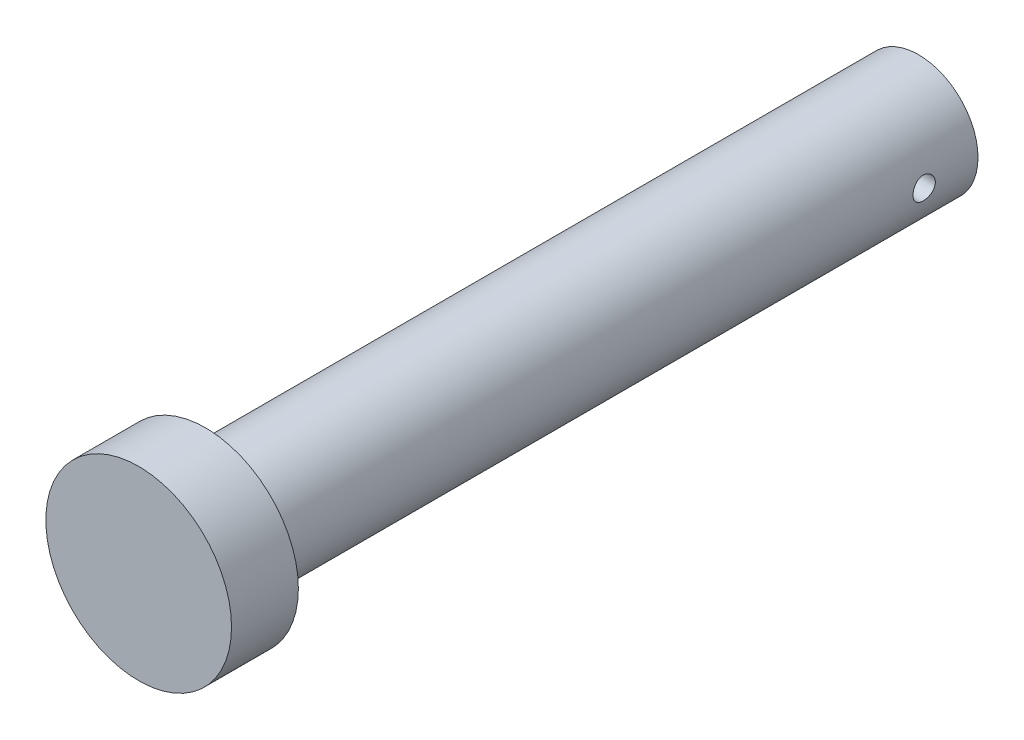
ISO-10303-21;
HEADER;
FILE_DESCRIPTION(('STEP AP214'),'2;1');
FILE_NAME('part.step','',(''),(''),'','','');
FILE_SCHEMA(('AUTOMOTIVE_DESIGN { 1 0 10303 214 1 1 1 1 }'));
ENDSEC;
DATA;
#1=APPLICATION_CONTEXT('core data for automotive mechanical design processes');
#2=APPLICATION_PROTOCOL_DEFINITION('international standard','automotive_design',2000,#1);
#3=PRODUCT_CONTEXT('',#1,'mechanical');
#4=PRODUCT('Part','Part','',(#3));
#5=PRODUCT_RELATED_PRODUCT_CATEGORY('part','',(#4));
#6=PRODUCT_DEFINITION_FORMATION('','',#4);
#7=PRODUCT_DEFINITION_CONTEXT('part definition',#1,'design');
#8=PRODUCT_DEFINITION('design','',#6,#7);
#9=PRODUCT_DEFINITION_SHAPE('','',#8);
#10=(LENGTH_UNIT() NAMED_UNIT(*) SI_UNIT(.MILLI.,.METRE.));
#11=(NAMED_UNIT(*) PLANE_ANGLE_UNIT() SI_UNIT($,.RADIAN.));
#12=(NAMED_UNIT(*) SI_UNIT($,.STERADIAN.) SOLID_ANGLE_UNIT());
#13=UNCERTAINTY_MEASURE_WITH_UNIT(LENGTH_MEASURE(1.E-05),#10,'distance_accuracy_value','');
#14=(GEOMETRIC_REPRESENTATION_CONTEXT(3) GLOBAL_UNCERTAINTY_ASSIGNED_CONTEXT((#13)) GLOBAL_UNIT_ASSIGNED_CONTEXT((#10,
#11,#12)) REPRESENTATION_CONTEXT('',''));
#15=CARTESIAN_POINT('',(0.,0.,0.));
#16=DIRECTION('',(0.,0.,1.));
#17=DIRECTION('',(1.,0.,0.));
#18=AXIS2_PLACEMENT_3D('',#15,#16,#17);
#19=CARTESIAN_POINT('',(0.,0.,9.));
#20=DIRECTION('',(0.,0.,-1.));
#21=DIRECTION('',(-1.,0.,0.));
#22=AXIS2_PLACEMENT_3D('',#19,#20,#21);
#23=CYLINDRICAL_SURFACE('',#22,12.5);
#24=CARTESIAN_POINT('',(0.,0.,9.));
#25=DIRECTION('',(0.,0.,1.));
#26=DIRECTION('',(1.,0.,0.));
#27=AXIS2_PLACEMENT_3D('',#24,#25,#26);
#28=CIRCLE('',#27,12.5);
#29=CARTESIAN_POINT('',(12.5,0.,9.));
#30=VERTEX_POINT('',#29);
#31=EDGE_CURVE('E10',#30,#30,#28,.T.);
#32=ORIENTED_EDGE('',*,*,#31,.F.);
#33=EDGE_LOOP('',(#32));
#34=FACE_BOUND('',#33,.T.);
#35=CARTESIAN_POINT('',(0.,0.,0.));
#36=DIRECTION('',(0.,0.,1.));
#37=DIRECTION('',(1.,0.,0.));
#38=AXIS2_PLACEMENT_3D('',#35,#36,#37);
#39=CIRCLE('',#38,12.5);
#40=CARTESIAN_POINT('',(12.5,0.,0.));
#41=VERTEX_POINT('',#40);
#42=EDGE_CURVE('E43',#41,#41,#39,.T.);
#43=ORIENTED_EDGE('',*,*,#42,.T.);
#44=EDGE_LOOP('',(#43));
#45=FACE_BOUND('',#44,.T.);
#46=ADVANCED_FACE('F31',(#34,#45),#23,.T.);
#47=CARTESIAN_POINT('',(0.,0.,9.));
#48=DIRECTION('',(0.,0.,1.));
#49=DIRECTION('',(1.,0.,0.));
#50=AXIS2_PLACEMENT_3D('',#47,#48,#49);
#51=PLANE('',#50);
#52=ORIENTED_EDGE('',*,*,#31,.T.);
#53=EDGE_LOOP('',(#52));
#54=FACE_BOUND('',#53,.T.);
#55=ADVANCED_FACE('F77',(#54),#51,.T.);
#56=CARTESIAN_POINT('',(0.,0.,0.));
#57=DIRECTION('',(0.,0.,1.));
#58=DIRECTION('',(1.,0.,0.));
#59=AXIS2_PLACEMENT_3D('',#56,#57,#58);
#60=PLANE('',#59);
#61=CARTESIAN_POINT('',(0.,0.,0.));
#62=DIRECTION('',(0.,0.,1.));
#63=DIRECTION('',(1.,0.,0.));
#64=AXIS2_PLACEMENT_3D('',#61,#62,#63);
#65=CIRCLE('',#64,8.);
#66=CARTESIAN_POINT('',(8.,0.,0.));
#67=VERTEX_POINT('',#66);
#68=EDGE_CURVE('E51',#67,#67,#65,.T.);
#69=ORIENTED_EDGE('',*,*,#68,.T.);
#70=EDGE_LOOP('',(#69));
#71=FACE_BOUND('',#70,.T.);
#72=ORIENTED_EDGE('',*,*,#42,.F.);
#73=EDGE_LOOP('',(#72));
#74=FACE_BOUND('',#73,.T.);
#75=ADVANCED_FACE('F73',(#71,#74),#60,.F.);
#76=CARTESIAN_POINT('',(0.,0.,-96.));
#77=DIRECTION('',(0.,0.,1.));
#78=DIRECTION('',(1.,0.,0.));
#79=AXIS2_PLACEMENT_3D('',#76,#77,#78);
#80=CYLINDRICAL_SURFACE('',#79,8.);
#81=CARTESIAN_POINT('',(8.,0.,-90.2552186975147));
#82=CARTESIAN_POINT('',(7.99999848833852,0.0834717464654709,-90.2552155079264));
#83=CARTESIAN_POINT('',(7.99868009921714,0.166984992730098,-90.2482276208953));
#84=CARTESIAN_POINT('',(7.9935478589052,0.331658129841798,-90.2204787023963));
#85=CARTESIAN_POINT('',(7.98973190166897,0.412815974152226,-90.199706046875));
#86=CARTESIAN_POINT('',(7.98003138765458,0.570372961851804,-90.1450459962554));
#87=CARTESIAN_POINT('',(7.97414869946483,0.646776330685349,-90.1111704450622));
#88=CARTESIAN_POINT('',(7.96095710599783,0.792807973094011,-90.0312998205919));
#89=CARTESIAN_POINT('',(7.9536483161829,0.862436794477325,-89.9853057283699));
#90=CARTESIAN_POINT('',(7.93831336430504,0.993783715930503,-89.881918929511));
#91=CARTESIAN_POINT('',(7.93028034856351,1.05540895503183,-89.8244092528446));
#92=CARTESIAN_POINT('',(7.9144531845865,1.16819606135369,-89.6998753884271));
#93=CARTESIAN_POINT('',(7.90665905354528,1.21935717689241,-89.6328505177454));
#94=CARTESIAN_POINT('',(7.89212551245005,1.31014998665793,-89.4905326091507));
#95=CARTESIAN_POINT('',(7.88539493886182,1.34968721969605,-89.4151783271975));
#96=CARTESIAN_POINT('',(7.87384713211987,1.41550524332283,-89.2587497823379));
#97=CARTESIAN_POINT('',(7.86902973396962,1.44178717713098,-89.1776760134035));
#98=CARTESIAN_POINT('',(7.8619226957455,1.480050535035,-89.0131034666003));
#99=CARTESIAN_POINT('',(7.85960445366405,1.49219390192039,-88.9296436003113));
#100=CARTESIAN_POINT('',(7.85767197152761,1.50233808095346,-88.7618413127065));
#101=CARTESIAN_POINT('',(7.8580574889876,1.50034016135374,-88.6774989712124));
#102=CARTESIAN_POINT('',(7.86146292701753,1.48238979602362,-88.5114991722486));
#103=CARTESIAN_POINT('',(7.86444808147334,1.46662149996045,-88.4298209832145));
#104=CARTESIAN_POINT('',(7.87266183284666,1.42186799396206,-88.2702902777321));
#105=CARTESIAN_POINT('',(7.87789052509516,1.39288222239499,-88.1924379240054));
#106=CARTESIAN_POINT('',(7.89003855292588,1.32233647179299,-88.0422300185145));
#107=CARTESIAN_POINT('',(7.89696783823366,1.28070213532456,-87.9699102269339));
#108=CARTESIAN_POINT('',(7.91172971602918,1.18609368930416,-87.8332139689745));
#109=CARTESIAN_POINT('',(7.91956240015522,1.13311842889266,-87.7688383097999));
#110=CARTESIAN_POINT('',(7.93540001272164,1.01633905685297,-87.6487937418423));
#111=CARTESIAN_POINT('',(7.94340571024031,0.952377436860676,-87.593278045063));
#112=CARTESIAN_POINT('',(7.95857386108318,0.815968037098823,-87.4937414568393));
#113=CARTESIAN_POINT('',(7.96573630595245,0.743520172255769,-87.4497206806443));
#114=CARTESIAN_POINT('',(7.97842539677509,0.59203498887467,-87.3744009436447));
#115=CARTESIAN_POINT('',(7.98394999136289,0.512989564446496,-87.3431179183968));
#116=CARTESIAN_POINT('',(7.99272505402719,0.350639115398697,-87.2943166044226));
#117=CARTESIAN_POINT('',(7.99597576367994,0.267334544277785,-87.2767968534693));
#118=CARTESIAN_POINT('',(7.99980360641981,0.10014865290338,-87.2562326664964));
#119=CARTESIAN_POINT('',(8.00041950912279,0.0162940126341308,-87.252978305985));
#120=CARTESIAN_POINT('',(7.99901543598228,-0.150761248092187,-87.2604741770623));
#121=CARTESIAN_POINT('',(7.99699558964431,-0.233961900480388,-87.27122372058));
#122=CARTESIAN_POINT('',(7.99057111500406,-0.396681573218219,-87.3062477326981));
#123=CARTESIAN_POINT('',(7.98618522374031,-0.476224261046065,-87.3304159800525));
#124=CARTESIAN_POINT('',(7.97551842212498,-0.630128631824633,-87.3914764042935));
#125=CARTESIAN_POINT('',(7.96923738311334,-0.704489962595101,-87.4283694450805));
#126=CARTESIAN_POINT('',(7.95538030357666,-0.846816671513211,-87.5142968256742));
#127=CARTESIAN_POINT('',(7.94779086174563,-0.91470327701512,-87.5634594360516));
#128=CARTESIAN_POINT('',(7.93219343489711,-1.04133832326455,-87.6723568348771));
#129=CARTESIAN_POINT('',(7.92418541084687,-1.10008590976087,-87.732092610516));
#130=CARTESIAN_POINT('',(7.9085247569745,-1.20757295872048,-87.8613910164262));
#131=CARTESIAN_POINT('',(7.90087825860257,-1.25616916218577,-87.9310736056401));
#132=CARTESIAN_POINT('',(7.88692985578532,-1.34096675057787,-88.0777363220385));
#133=CARTESIAN_POINT('',(7.8806279013735,-1.37716859613924,-88.1547161778852));
#134=CARTESIAN_POINT('',(7.87013024209574,-1.43594673512823,-88.3134245647573));
#135=CARTESIAN_POINT('',(7.86592440436878,-1.45858868794786,-88.3951280770741));
#136=CARTESIAN_POINT('',(7.86007203802415,-1.48980679326235,-88.5612659200361));
#137=CARTESIAN_POINT('',(7.8584252206579,-1.49838453270708,-88.6456999414851));
#138=CARTESIAN_POINT('',(7.85789199803857,-1.50117762148354,-88.8134670289562));
#139=CARTESIAN_POINT('',(7.85896215974293,-1.49561895003499,-88.8967962784717));
#140=CARTESIAN_POINT('',(7.86364600659998,-1.47079175378803,-89.06131011956));
#141=CARTESIAN_POINT('',(7.86725967655747,-1.45152331089332,-89.1424947239421));
#142=CARTESIAN_POINT('',(7.8766050802318,-1.39991887583263,-89.3002931823102));
#143=CARTESIAN_POINT('',(7.88233284594965,-1.36760735397252,-89.3769152888605));
#144=CARTESIAN_POINT('',(7.8952638755184,-1.29085868912205,-89.5236869517555));
#145=CARTESIAN_POINT('',(7.90246724360119,-1.24642068948186,-89.5938360503595));
#146=CARTESIAN_POINT('',(7.91767266107745,-1.14589487339536,-89.726802377557));
#147=CARTESIAN_POINT('',(7.92568505353043,-1.08964259864304,-89.7894941100818));
#148=CARTESIAN_POINT('',(7.94152833918735,-0.967427926742292,-89.9046238599792));
#149=CARTESIAN_POINT('',(7.94935919027328,-0.901463301891618,-89.9570595184948));
#150=CARTESIAN_POINT('',(7.96403975968049,-0.760984945071874,-90.0506296501418));
#151=CARTESIAN_POINT('',(7.97088000990561,-0.686399590640515,-90.0916581260053));
#152=CARTESIAN_POINT('',(7.98271619380687,-0.531290113653833,-90.1605363341198));
#153=CARTESIAN_POINT('',(7.98771385879037,-0.450771651705249,-90.1883984445616));
#154=CARTESIAN_POINT('',(7.99428290707632,-0.308347202825157,-90.2244960119334));
#155=CARTESIAN_POINT('',(7.99641470878206,-0.247273810251873,-90.2359973278275));
#156=CARTESIAN_POINT('',(7.9992737995401,-0.124141247115159,-90.2513597596312));
#157=CARTESIAN_POINT('',(8.00000112429805,-0.06208210165271,-90.2552210697706));
#158=CARTESIAN_POINT('',(8.,0.,-90.2552186975147));
#159=B_SPLINE_CURVE_WITH_KNOTS('',3,(#81,#82,#83,#84,#85,#86,#87,#88,#89,#90,#91,#92,#93,#94,
#95,#96,#97,#98,#99,#100,#101,#102,#103,#104,#105,#106,#107,#108,#109,#110,#111,#112,#113,#114,
#115,#116,#117,#118,#119,#120,#121,#122,#123,#124,#125,#126,#127,#128,#129,#130,#131,#132,#133,
#134,#135,#136,#137,#138,#139,#140,#141,#142,#143,#144,#145,#146,#147,#148,#149,#150,#151,#152,
#153,#154,#155,#156,#157,#158),.UNSPECIFIED.,.T.,.F.,(4,2,2,2,2,2,2,2,2,2,2,2,2,2,2,2,2,2,2,2,2,
2,2,2,2,2,2,2,2,2,2,2,2,2,2,2,2,2,4),(0.,0.250188200964925,0.500587642535452,0.750761271230911,
1.00091465336891,1.25375118013631,1.50660586283616,1.76146190504357,2.01629596311948,
2.26818151445336,2.52004447587256,2.76859000612766,3.01714609846786,3.2671926262953,
3.5172645404986,3.77127768464076,4.02529337544947,4.27962588321697,4.53393136673745,
4.78448174076096,5.03501980464583,5.28360233907827,5.53220175338031,5.78351778017707,
6.03485728413098,6.28953436987299,6.54420198954945,6.79762627818559,7.05102196946512,
7.30039252231746,7.54976158541505,7.7986649620769,8.0475859265542,8.30023369966378,
8.55293951262253,8.80792048916313,9.06266126931171,9.24874344524407,9.43482089039539),.UNSPECIFIED.);
#160=CARTESIAN_POINT('',(8.,0.,-90.2552186975147));
#161=VERTEX_POINT('',#160);
#162=EDGE_CURVE('E34',#161,#161,#159,.T.);
#163=ORIENTED_EDGE('',*,*,#162,.F.);
#164=EDGE_LOOP('',(#163));
#165=FACE_BOUND('',#164,.T.);
#166=CARTESIAN_POINT('',(-8.,0.,-90.2552186975147));
#167=CARTESIAN_POINT('',(-7.99999848833852,-0.0834717464654709,-90.2552155079264));
#168=CARTESIAN_POINT('',(-7.99868009921714,-0.166984992730098,-90.2482276208953));
#169=CARTESIAN_POINT('',(-7.9935478589052,-0.331658129841798,-90.2204787023963));
#170=CARTESIAN_POINT('',(-7.98973190166897,-0.412815974152226,-90.199706046875));
#171=CARTESIAN_POINT('',(-7.98003138765458,-0.570372961851804,-90.1450459962554));
#172=CARTESIAN_POINT('',(-7.97414869946483,-0.646776330685349,-90.1111704450622));
#173=CARTESIAN_POINT('',(-7.96095710599783,-0.792807973094011,-90.0312998205919));
#174=CARTESIAN_POINT('',(-7.9536483161829,-0.862436794477325,-89.9853057283699));
#175=CARTESIAN_POINT('',(-7.93831336430504,-0.993783715930503,-89.881918929511));
#176=CARTESIAN_POINT('',(-7.93028034856351,-1.05540895503183,-89.8244092528446));
#177=CARTESIAN_POINT('',(-7.9144531845865,-1.16819606135369,-89.6998753884271));
#178=CARTESIAN_POINT('',(-7.90665905354528,-1.21935717689241,-89.6328505177454));
#179=CARTESIAN_POINT('',(-7.89212551245005,-1.31014998665793,-89.4905326091507));
#180=CARTESIAN_POINT('',(-7.88539493886182,-1.34968721969605,-89.4151783271975));
#181=CARTESIAN_POINT('',(-7.87384713211987,-1.41550524332283,-89.2587497823379));
#182=CARTESIAN_POINT('',(-7.86902973396962,-1.44178717713098,-89.1776760134035));
#183=CARTESIAN_POINT('',(-7.8619226957455,-1.480050535035,-89.0131034666003));
#184=CARTESIAN_POINT('',(-7.85960445366405,-1.49219390192039,-88.9296436003113));
#185=CARTESIAN_POINT('',(-7.85767197152761,-1.50233808095346,-88.7618413127065));
#186=CARTESIAN_POINT('',(-7.8580574889876,-1.50034016135374,-88.6774989712124));
#187=CARTESIAN_POINT('',(-7.86146292701753,-1.48238979602362,-88.5114991722486));
#188=CARTESIAN_POINT('',(-7.86444808147334,-1.46662149996045,-88.4298209832145));
#189=CARTESIAN_POINT('',(-7.87266183284666,-1.42186799396206,-88.2702902777321));
#190=CARTESIAN_POINT('',(-7.87789052509516,-1.39288222239499,-88.1924379240054));
#191=CARTESIAN_POINT('',(-7.89003855292588,-1.32233647179299,-88.0422300185145));
#192=CARTESIAN_POINT('',(-7.89696783823366,-1.28070213532456,-87.9699102269339));
#193=CARTESIAN_POINT('',(-7.91172971602918,-1.18609368930416,-87.8332139689745));
#194=CARTESIAN_POINT('',(-7.91956240015522,-1.13311842889266,-87.7688383097999));
#195=CARTESIAN_POINT('',(-7.93540001272164,-1.01633905685297,-87.6487937418423));
#196=CARTESIAN_POINT('',(-7.94340571024031,-0.952377436860676,-87.593278045063));
#197=CARTESIAN_POINT('',(-7.95857386108318,-0.815968037098823,-87.4937414568393));
#198=CARTESIAN_POINT('',(-7.96573630595245,-0.743520172255769,-87.4497206806443));
#199=CARTESIAN_POINT('',(-7.97842539677509,-0.59203498887467,-87.3744009436447));
#200=CARTESIAN_POINT('',(-7.98394999136289,-0.512989564446496,-87.3431179183968));
#201=CARTESIAN_POINT('',(-7.99272505402719,-0.350639115398697,-87.2943166044226));
#202=CARTESIAN_POINT('',(-7.99597576367994,-0.267334544277785,-87.2767968534693));
#203=CARTESIAN_POINT('',(-7.99980360641981,-0.10014865290338,-87.2562326664964));
#204=CARTESIAN_POINT('',(-8.00041950912279,-0.0162940126341308,-87.252978305985));
#205=CARTESIAN_POINT('',(-7.99901543598228,0.150761248092187,-87.2604741770623));
#206=CARTESIAN_POINT('',(-7.99699558964431,0.233961900480388,-87.27122372058));
#207=CARTESIAN_POINT('',(-7.99057111500406,0.396681573218219,-87.3062477326981));
#208=CARTESIAN_POINT('',(-7.98618522374031,0.476224261046065,-87.3304159800525));
#209=CARTESIAN_POINT('',(-7.97551842212498,0.630128631824633,-87.3914764042935));
#210=CARTESIAN_POINT('',(-7.96923738311334,0.704489962595101,-87.4283694450805));
#211=CARTESIAN_POINT('',(-7.95538030357666,0.846816671513211,-87.5142968256742));
#212=CARTESIAN_POINT('',(-7.94779086174563,0.91470327701512,-87.5634594360516));
#213=CARTESIAN_POINT('',(-7.93219343489711,1.04133832326455,-87.6723568348771));
#214=CARTESIAN_POINT('',(-7.92418541084687,1.10008590976087,-87.732092610516));
#215=CARTESIAN_POINT('',(-7.9085247569745,1.20757295872048,-87.8613910164262));
#216=CARTESIAN_POINT('',(-7.90087825860257,1.25616916218577,-87.9310736056401));
#217=CARTESIAN_POINT('',(-7.88692985578532,1.34096675057787,-88.0777363220385));
#218=CARTESIAN_POINT('',(-7.8806279013735,1.37716859613924,-88.1547161778852));
#219=CARTESIAN_POINT('',(-7.87013024209574,1.43594673512823,-88.3134245647573));
#220=CARTESIAN_POINT('',(-7.86592440436878,1.45858868794786,-88.3951280770741));
#221=CARTESIAN_POINT('',(-7.86007203802415,1.48980679326235,-88.5612659200361));
#222=CARTESIAN_POINT('',(-7.8584252206579,1.49838453270708,-88.6456999414851));
#223=CARTESIAN_POINT('',(-7.85789199803857,1.50117762148354,-88.8134670289562));
#224=CARTESIAN_POINT('',(-7.85896215974293,1.49561895003499,-88.8967962784717));
#225=CARTESIAN_POINT('',(-7.86364600659998,1.47079175378803,-89.06131011956));
#226=CARTESIAN_POINT('',(-7.86725967655747,1.45152331089332,-89.1424947239421));
#227=CARTESIAN_POINT('',(-7.8766050802318,1.39991887583263,-89.3002931823102));
#228=CARTESIAN_POINT('',(-7.88233284594965,1.36760735397252,-89.3769152888605));
#229=CARTESIAN_POINT('',(-7.8952638755184,1.29085868912205,-89.5236869517555));
#230=CARTESIAN_POINT('',(-7.90246724360119,1.24642068948186,-89.5938360503595));
#231=CARTESIAN_POINT('',(-7.91767266107745,1.14589487339536,-89.726802377557));
#232=CARTESIAN_POINT('',(-7.92568505353043,1.08964259864304,-89.7894941100818));
#233=CARTESIAN_POINT('',(-7.94152833918735,0.967427926742292,-89.9046238599792));
#234=CARTESIAN_POINT('',(-7.94935919027328,0.901463301891618,-89.9570595184948));
#235=CARTESIAN_POINT('',(-7.96403975968049,0.760984945071874,-90.0506296501418));
#236=CARTESIAN_POINT('',(-7.97088000990561,0.686399590640515,-90.0916581260053));
#237=CARTESIAN_POINT('',(-7.98271619380687,0.531290113653833,-90.1605363341198));
#238=CARTESIAN_POINT('',(-7.98771385879037,0.450771651705249,-90.1883984445616));
#239=CARTESIAN_POINT('',(-7.99428290707632,0.308347202825157,-90.2244960119334));
#240=CARTESIAN_POINT('',(-7.99641470878206,0.247273810251873,-90.2359973278275));
#241=CARTESIAN_POINT('',(-7.9992737995401,0.124141247115159,-90.2513597596312));
#242=CARTESIAN_POINT('',(-8.00000112429805,0.06208210165271,-90.2552210697706));
#243=CARTESIAN_POINT('',(-8.,0.,-90.2552186975147));
#244=B_SPLINE_CURVE_WITH_KNOTS('',3,(#166,#167,#168,#169,#170,#171,#172,#173,#174,#175,#176,
#177,#178,#179,#180,#181,#182,#183,#184,#185,#186,#187,#188,#189,#190,#191,#192,#193,#194,#195,
#196,#197,#198,#199,#200,#201,#202,#203,#204,#205,#206,#207,#208,#209,#210,#211,#212,#213,#214,
#215,#216,#217,#218,#219,#220,#221,#222,#223,#224,#225,#226,#227,#228,#229,#230,#231,#232,#233,
#234,#235,#236,#237,#238,#239,#240,#241,#242,#243),.UNSPECIFIED.,.T.,.F.,(4,2,2,2,2,2,2,2,2,2,2,
2,2,2,2,2,2,2,2,2,2,2,2,2,2,2,2,2,2,2,2,2,2,2,2,2,2,2,4),(0.,0.250188200964925,
0.500587642535452,0.750761271230911,1.00091465336891,1.25375118013631,1.50660586283616,
1.76146190504357,2.01629596311948,2.26818151445336,2.52004447587256,2.76859000612766,
3.01714609846786,3.2671926262953,3.5172645404986,3.77127768464076,4.02529337544947,
4.27962588321697,4.53393136673745,4.78448174076096,5.03501980464583,5.28360233907827,
5.53220175338031,5.78351778017707,6.03485728413098,6.28953436987299,6.54420198954945,
6.79762627818559,7.05102196946512,7.30039252231746,7.54976158541505,7.7986649620769,
8.0475859265542,8.30023369966378,8.55293951262253,8.80792048916313,9.06266126931171,
9.24874344524407,9.43482089039539),.UNSPECIFIED.);
#245=CARTESIAN_POINT('',(-8.,0.,-90.2552186975147));
#246=VERTEX_POINT('',#245);
#247=EDGE_CURVE('E53',#246,#246,#244,.T.);
#248=ORIENTED_EDGE('',*,*,#247,.F.);
#249=EDGE_LOOP('',(#248));
#250=FACE_BOUND('',#249,.T.);
#251=CARTESIAN_POINT('',(0.,0.,-96.));
#252=DIRECTION('',(0.,0.,1.));
#253=DIRECTION('',(1.,0.,0.));
#254=AXIS2_PLACEMENT_3D('',#251,#252,#253);
#255=CIRCLE('',#254,8.);
#256=CARTESIAN_POINT('',(8.,0.,-96.));
#257=VERTEX_POINT('',#256);
#258=EDGE_CURVE('E48',#257,#257,#255,.T.);
#259=ORIENTED_EDGE('',*,*,#258,.T.);
#260=EDGE_LOOP('',(#259));
#261=FACE_BOUND('',#260,.T.);
#262=ORIENTED_EDGE('',*,*,#68,.F.);
#263=EDGE_LOOP('',(#262));
#264=FACE_BOUND('',#263,.T.);
#265=ADVANCED_FACE('F58',(#165,#250,#261,#264),#80,.T.);
#266=CARTESIAN_POINT('',(0.,0.,-96.));
#267=DIRECTION('',(0.,0.,1.));
#268=DIRECTION('',(1.,0.,0.));
#269=AXIS2_PLACEMENT_3D('',#266,#267,#268);
#270=PLANE('',#269);
#271=ORIENTED_EDGE('',*,*,#258,.F.);
#272=EDGE_LOOP('',(#271));
#273=FACE_BOUND('',#272,.T.);
#274=ADVANCED_FACE('F65',(#273),#270,.F.);
#275=CARTESIAN_POINT('',(-48.,0.,-88.7552186975147));
#276=DIRECTION('',(1.,0.,0.));
#277=DIRECTION('',(0.,0.,-1.));
#278=AXIS2_PLACEMENT_3D('',#275,#276,#277);
#279=CYLINDRICAL_SURFACE('',#278,1.5);
#280=ORIENTED_EDGE('',*,*,#162,.T.);
#281=EDGE_LOOP('',(#280));
#282=FACE_BOUND('',#281,.T.);
#283=ORIENTED_EDGE('',*,*,#247,.T.);
#284=EDGE_LOOP('',(#283));
#285=FACE_BOUND('',#284,.T.);
#286=ADVANCED_FACE('F62',(#282,#285),#279,.F.);
#287=CLOSED_SHELL('',(#46,#55,#75,#265,#274,#286));
#288=MANIFOLD_SOLID_BREP('B2',#287);
#289=ADVANCED_BREP_SHAPE_REPRESENTATION('',(#18,#288),#14);
#290=SHAPE_DEFINITION_REPRESENTATION(#9,#289);
ENDSEC;
END-ISO-10303-21;
